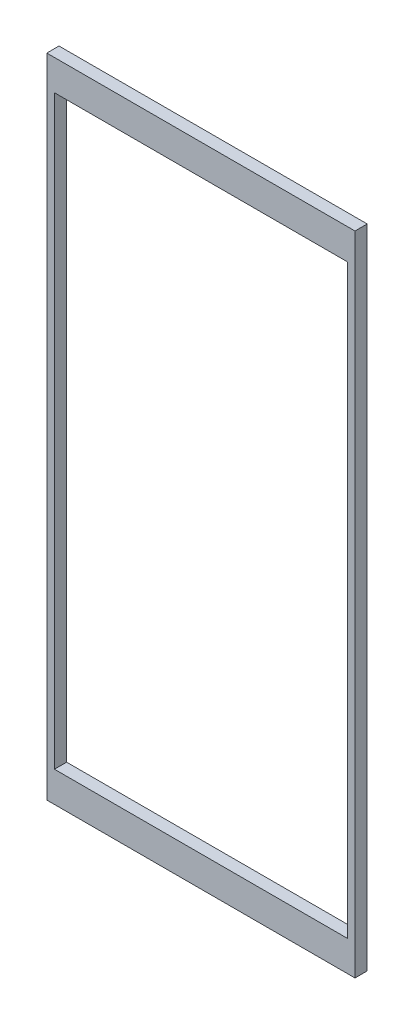
ISO-10303-21;
HEADER;
FILE_DESCRIPTION(('STEP AP214'),'2;1');
FILE_NAME('part.step','',(''),(''),'','','');
FILE_SCHEMA(('AUTOMOTIVE_DESIGN { 1 0 10303 214 1 1 1 1 }'));
ENDSEC;
DATA;
#1=APPLICATION_CONTEXT('core data for automotive mechanical design processes');
#2=APPLICATION_PROTOCOL_DEFINITION('international standard','automotive_design',2000,#1);
#3=PRODUCT_CONTEXT('',#1,'mechanical');
#4=PRODUCT('Part','Part','',(#3));
#5=PRODUCT_RELATED_PRODUCT_CATEGORY('part','',(#4));
#6=PRODUCT_DEFINITION_FORMATION('','',#4);
#7=PRODUCT_DEFINITION_CONTEXT('part definition',#1,'design');
#8=PRODUCT_DEFINITION('design','',#6,#7);
#9=PRODUCT_DEFINITION_SHAPE('','',#8);
#10=(LENGTH_UNIT() NAMED_UNIT(*) SI_UNIT(.MILLI.,.METRE.));
#11=(NAMED_UNIT(*) PLANE_ANGLE_UNIT() SI_UNIT($,.RADIAN.));
#12=(NAMED_UNIT(*) SI_UNIT($,.STERADIAN.) SOLID_ANGLE_UNIT());
#13=UNCERTAINTY_MEASURE_WITH_UNIT(LENGTH_MEASURE(1.E-05),#10,'distance_accuracy_value','');
#14=(GEOMETRIC_REPRESENTATION_CONTEXT(3) GLOBAL_UNCERTAINTY_ASSIGNED_CONTEXT((#13)) GLOBAL_UNIT_ASSIGNED_CONTEXT((#10,
#11,#12)) REPRESENTATION_CONTEXT('',''));
#15=CARTESIAN_POINT('',(0.,0.,0.));
#16=DIRECTION('',(0.,0.,1.));
#17=DIRECTION('',(1.,0.,0.));
#18=AXIS2_PLACEMENT_3D('',#15,#16,#17);
#19=CARTESIAN_POINT('',(0.,0.,8.));
#20=DIRECTION('',(1.,0.,0.));
#21=DIRECTION('',(0.,1.,0.));
#22=AXIS2_PLACEMENT_3D('',#19,#20,#21);
#23=PLANE('',#22);
#24=DIRECTION('',(0.,-1.,0.));
#25=VECTOR('',#24,1.);
#26=CARTESIAN_POINT('',(0.,0.,0.));
#27=LINE('',#26,#25);
#28=CARTESIAN_POINT('',(0.,424.,0.));
#29=VERTEX_POINT('',#28);
#30=CARTESIAN_POINT('',(0.,0.,0.));
#31=VERTEX_POINT('',#30);
#32=EDGE_CURVE('E155',#29,#31,#27,.T.);
#33=ORIENTED_EDGE('',*,*,#32,.T.);
#34=DIRECTION('',(0.,0.,-1.));
#35=VECTOR('',#34,1.);
#36=CARTESIAN_POINT('',(0.,0.,8.));
#37=LINE('',#36,#35);
#38=CARTESIAN_POINT('',(0.,0.,8.));
#39=VERTEX_POINT('',#38);
#40=EDGE_CURVE('E11',#39,#31,#37,.T.);
#41=ORIENTED_EDGE('',*,*,#40,.F.);
#42=DIRECTION('',(0.,-1.,0.));
#43=VECTOR('',#42,1.);
#44=CARTESIAN_POINT('',(0.,0.,8.));
#45=LINE('',#44,#43);
#46=CARTESIAN_POINT('',(0.,424.,8.));
#47=VERTEX_POINT('',#46);
#48=EDGE_CURVE('E161',#47,#39,#45,.T.);
#49=ORIENTED_EDGE('',*,*,#48,.F.);
#50=DIRECTION('',(0.,0.,-1.));
#51=VECTOR('',#50,1.);
#52=CARTESIAN_POINT('',(0.,424.,8.));
#53=LINE('',#52,#51);
#54=EDGE_CURVE('E175',#47,#29,#53,.T.);
#55=ORIENTED_EDGE('',*,*,#54,.T.);
#56=EDGE_LOOP('',(#33,#41,#49,#55));
#57=FACE_BOUND('',#56,.T.);
#58=ADVANCED_FACE('F43',(#57),#23,.F.);
#59=CARTESIAN_POINT('',(0.,0.,8.));
#60=DIRECTION('',(0.,1.,0.));
#61=DIRECTION('',(0.,0.,1.));
#62=AXIS2_PLACEMENT_3D('',#59,#60,#61);
#63=PLANE('',#62);
#64=DIRECTION('',(1.,0.,0.));
#65=VECTOR('',#64,1.);
#66=CARTESIAN_POINT('',(0.,0.,0.));
#67=LINE('',#66,#65);
#68=CARTESIAN_POINT('',(202.,0.,0.));
#69=VERTEX_POINT('',#68);
#70=EDGE_CURVE('E179',#31,#69,#67,.T.);
#71=ORIENTED_EDGE('',*,*,#70,.T.);
#72=DIRECTION('',(0.,0.,-1.));
#73=VECTOR('',#72,1.);
#74=CARTESIAN_POINT('',(202.,0.,8.));
#75=LINE('',#74,#73);
#76=CARTESIAN_POINT('',(202.,0.,8.));
#77=VERTEX_POINT('',#76);
#78=EDGE_CURVE('E51',#77,#69,#75,.T.);
#79=ORIENTED_EDGE('',*,*,#78,.F.);
#80=DIRECTION('',(1.,0.,0.));
#81=VECTOR('',#80,1.);
#82=CARTESIAN_POINT('',(0.,0.,8.));
#83=LINE('',#82,#81);
#84=EDGE_CURVE('E165',#39,#77,#83,.T.);
#85=ORIENTED_EDGE('',*,*,#84,.F.);
#86=ORIENTED_EDGE('',*,*,#40,.T.);
#87=EDGE_LOOP('',(#71,#79,#85,#86));
#88=FACE_BOUND('',#87,.T.);
#89=ADVANCED_FACE('F213',(#88),#63,.F.);
#90=CARTESIAN_POINT('',(202.,0.,8.));
#91=DIRECTION('',(-1.,0.,0.));
#92=DIRECTION('',(0.,-1.,0.));
#93=AXIS2_PLACEMENT_3D('',#90,#91,#92);
#94=PLANE('',#93);
#95=DIRECTION('',(0.,1.,0.));
#96=VECTOR('',#95,1.);
#97=CARTESIAN_POINT('',(202.,0.,0.));
#98=LINE('',#97,#96);
#99=CARTESIAN_POINT('',(202.,424.,0.));
#100=VERTEX_POINT('',#99);
#101=EDGE_CURVE('E182',#69,#100,#98,.T.);
#102=ORIENTED_EDGE('',*,*,#101,.T.);
#103=DIRECTION('',(0.,0.,-1.));
#104=VECTOR('',#103,1.);
#105=CARTESIAN_POINT('',(202.,424.,8.));
#106=LINE('',#105,#104);
#107=CARTESIAN_POINT('',(202.,424.,8.));
#108=VERTEX_POINT('',#107);
#109=EDGE_CURVE('E190',#108,#100,#106,.T.);
#110=ORIENTED_EDGE('',*,*,#109,.F.);
#111=DIRECTION('',(0.,1.,0.));
#112=VECTOR('',#111,1.);
#113=CARTESIAN_POINT('',(202.,0.,8.));
#114=LINE('',#113,#112);
#115=EDGE_CURVE('E169',#77,#108,#114,.T.);
#116=ORIENTED_EDGE('',*,*,#115,.F.);
#117=ORIENTED_EDGE('',*,*,#78,.T.);
#118=EDGE_LOOP('',(#102,#110,#116,#117));
#119=FACE_BOUND('',#118,.T.);
#120=ADVANCED_FACE('F199',(#119),#94,.F.);
#121=CARTESIAN_POINT('',(0.,424.,8.));
#122=DIRECTION('',(0.,-1.,0.));
#123=DIRECTION('',(0.,0.,-1.));
#124=AXIS2_PLACEMENT_3D('',#121,#122,#123);
#125=PLANE('',#124);
#126=DIRECTION('',(-1.,0.,0.));
#127=VECTOR('',#126,1.);
#128=CARTESIAN_POINT('',(0.,424.,0.));
#129=LINE('',#128,#127);
#130=EDGE_CURVE('E166',#100,#29,#129,.T.);
#131=ORIENTED_EDGE('',*,*,#130,.T.);
#132=ORIENTED_EDGE('',*,*,#54,.F.);
#133=DIRECTION('',(-1.,0.,0.));
#134=VECTOR('',#133,1.);
#135=CARTESIAN_POINT('',(0.,424.,8.));
#136=LINE('',#135,#134);
#137=EDGE_CURVE('E172',#108,#47,#136,.T.);
#138=ORIENTED_EDGE('',*,*,#137,.F.);
#139=ORIENTED_EDGE('',*,*,#109,.T.);
#140=EDGE_LOOP('',(#131,#132,#138,#139));
#141=FACE_BOUND('',#140,.T.);
#142=ADVANCED_FACE('F208',(#141),#125,.F.);
#143=CARTESIAN_POINT('',(0.,0.,8.));
#144=DIRECTION('',(0.,0.,-1.));
#145=DIRECTION('',(-1.,0.,0.));
#146=AXIS2_PLACEMENT_3D('',#143,#144,#145);
#147=PLANE('',#146);
#148=DIRECTION('',(1.,0.,0.));
#149=VECTOR('',#148,1.);
#150=CARTESIAN_POINT('',(197.,404.,8.));
#151=LINE('',#150,#149);
#152=CARTESIAN_POINT('',(4.99999999999992,404.,8.));
#153=VERTEX_POINT('',#152);
#154=CARTESIAN_POINT('',(197.,404.,8.));
#155=VERTEX_POINT('',#154);
#156=EDGE_CURVE('E117',#153,#155,#151,.T.);
#157=ORIENTED_EDGE('',*,*,#156,.T.);
#158=DIRECTION('',(0.,-1.,0.));
#159=VECTOR('',#158,1.);
#160=CARTESIAN_POINT('',(197.,404.,8.));
#161=LINE('',#160,#159);
#162=CARTESIAN_POINT('',(197.,20.,8.));
#163=VERTEX_POINT('',#162);
#164=EDGE_CURVE('E110',#155,#163,#161,.T.);
#165=ORIENTED_EDGE('',*,*,#164,.T.);
#166=DIRECTION('',(-1.,0.,0.));
#167=VECTOR('',#166,1.);
#168=CARTESIAN_POINT('',(197.,20.,8.));
#169=LINE('',#168,#167);
#170=CARTESIAN_POINT('',(4.99999999999987,20.,8.));
#171=VERTEX_POINT('',#170);
#172=EDGE_CURVE('E120',#163,#171,#169,.T.);
#173=ORIENTED_EDGE('',*,*,#172,.T.);
#174=DIRECTION('',(0.,1.,0.));
#175=VECTOR('',#174,1.);
#176=CARTESIAN_POINT('',(4.99999999999992,404.,8.));
#177=LINE('',#176,#175);
#178=EDGE_CURVE('E58',#171,#153,#177,.T.);
#179=ORIENTED_EDGE('',*,*,#178,.T.);
#180=EDGE_LOOP('',(#157,#165,#173,#179));
#181=FACE_BOUND('',#180,.T.);
#182=ORIENTED_EDGE('',*,*,#48,.T.);
#183=ORIENTED_EDGE('',*,*,#84,.T.);
#184=ORIENTED_EDGE('',*,*,#115,.T.);
#185=ORIENTED_EDGE('',*,*,#137,.T.);
#186=EDGE_LOOP('',(#182,#183,#184,#185));
#187=FACE_BOUND('',#186,.T.);
#188=ADVANCED_FACE('F125',(#181,#187),#147,.F.);
#189=CARTESIAN_POINT('',(0.,0.,0.));
#190=DIRECTION('',(0.,0.,-1.));
#191=DIRECTION('',(-1.,0.,0.));
#192=AXIS2_PLACEMENT_3D('',#189,#190,#191);
#193=PLANE('',#192);
#194=CARTESIAN_POINT('',(184.,10.,0.));
#195=DIRECTION('',(0.,0.,1.));
#196=DIRECTION('',(-1.,0.,0.));
#197=AXIS2_PLACEMENT_3D('',#194,#195,#196);
#198=CIRCLE('',#197,2.);
#199=CARTESIAN_POINT('',(182.,10.,0.));
#200=VERTEX_POINT('',#199);
#201=EDGE_CURVE('E292',#200,#200,#198,.T.);
#202=ORIENTED_EDGE('',*,*,#201,.T.);
#203=EDGE_LOOP('',(#202));
#204=FACE_BOUND('',#203,.T.);
#205=CARTESIAN_POINT('',(17.9999999999999,10.,0.));
#206=DIRECTION('',(0.,0.,1.));
#207=DIRECTION('',(-1.,0.,0.));
#208=AXIS2_PLACEMENT_3D('',#205,#206,#207);
#209=CIRCLE('',#208,2.);
#210=CARTESIAN_POINT('',(15.9999999999999,10.,0.));
#211=VERTEX_POINT('',#210);
#212=EDGE_CURVE('E305',#211,#211,#209,.T.);
#213=ORIENTED_EDGE('',*,*,#212,.T.);
#214=EDGE_LOOP('',(#213));
#215=FACE_BOUND('',#214,.T.);
#216=CARTESIAN_POINT('',(101.,10.,0.));
#217=DIRECTION('',(0.,0.,1.));
#218=DIRECTION('',(-1.,0.,0.));
#219=AXIS2_PLACEMENT_3D('',#216,#217,#218);
#220=CIRCLE('',#219,2.);
#221=CARTESIAN_POINT('',(99.,10.,0.));
#222=VERTEX_POINT('',#221);
#223=EDGE_CURVE('E313',#222,#222,#220,.T.);
#224=ORIENTED_EDGE('',*,*,#223,.T.);
#225=EDGE_LOOP('',(#224));
#226=FACE_BOUND('',#225,.T.);
#227=CARTESIAN_POINT('',(184.,414.,0.));
#228=DIRECTION('',(0.,0.,-1.));
#229=DIRECTION('',(-1.,0.,0.));
#230=AXIS2_PLACEMENT_3D('',#227,#228,#229);
#231=CIRCLE('',#230,2.);
#232=CARTESIAN_POINT('',(182.,414.,0.));
#233=VERTEX_POINT('',#232);
#234=EDGE_CURVE('E320',#233,#233,#231,.T.);
#235=ORIENTED_EDGE('',*,*,#234,.F.);
#236=EDGE_LOOP('',(#235));
#237=FACE_BOUND('',#236,.T.);
#238=CARTESIAN_POINT('',(17.9999999999999,414.,0.));
#239=DIRECTION('',(0.,0.,-1.));
#240=DIRECTION('',(-1.,0.,0.));
#241=AXIS2_PLACEMENT_3D('',#238,#239,#240);
#242=CIRCLE('',#241,2.);
#243=CARTESIAN_POINT('',(15.9999999999999,414.,0.));
#244=VERTEX_POINT('',#243);
#245=EDGE_CURVE('E324',#244,#244,#242,.T.);
#246=ORIENTED_EDGE('',*,*,#245,.F.);
#247=EDGE_LOOP('',(#246));
#248=FACE_BOUND('',#247,.T.);
#249=CARTESIAN_POINT('',(101.,414.,0.));
#250=DIRECTION('',(0.,0.,-1.));
#251=DIRECTION('',(-1.,0.,0.));
#252=AXIS2_PLACEMENT_3D('',#249,#250,#251);
#253=CIRCLE('',#252,2.);
#254=CARTESIAN_POINT('',(99.,414.,0.));
#255=VERTEX_POINT('',#254);
#256=EDGE_CURVE('E297',#255,#255,#253,.T.);
#257=ORIENTED_EDGE('',*,*,#256,.F.);
#258=EDGE_LOOP('',(#257));
#259=FACE_BOUND('',#258,.T.);
#260=DIRECTION('',(0.,-1.,0.));
#261=VECTOR('',#260,1.);
#262=CARTESIAN_POINT('',(197.,404.,0.));
#263=LINE('',#262,#261);
#264=CARTESIAN_POINT('',(197.,404.,0.));
#265=VERTEX_POINT('',#264);
#266=CARTESIAN_POINT('',(197.,20.,0.));
#267=VERTEX_POINT('',#266);
#268=EDGE_CURVE('E66',#265,#267,#263,.T.);
#269=ORIENTED_EDGE('',*,*,#268,.F.);
#270=DIRECTION('',(1.,0.,0.));
#271=VECTOR('',#270,1.);
#272=CARTESIAN_POINT('',(197.,404.,0.));
#273=LINE('',#272,#271);
#274=CARTESIAN_POINT('',(4.99999999999992,404.,0.));
#275=VERTEX_POINT('',#274);
#276=EDGE_CURVE('E129',#275,#265,#273,.T.);
#277=ORIENTED_EDGE('',*,*,#276,.F.);
#278=DIRECTION('',(0.,1.,0.));
#279=VECTOR('',#278,1.);
#280=CARTESIAN_POINT('',(4.99999999999992,404.,0.));
#281=LINE('',#280,#279);
#282=CARTESIAN_POINT('',(4.99999999999987,20.,0.));
#283=VERTEX_POINT('',#282);
#284=EDGE_CURVE('E133',#283,#275,#281,.T.);
#285=ORIENTED_EDGE('',*,*,#284,.F.);
#286=DIRECTION('',(-1.,0.,0.));
#287=VECTOR('',#286,1.);
#288=CARTESIAN_POINT('',(197.,20.,0.));
#289=LINE('',#288,#287);
#290=EDGE_CURVE('E145',#267,#283,#289,.T.);
#291=ORIENTED_EDGE('',*,*,#290,.F.);
#292=EDGE_LOOP('',(#269,#277,#285,#291));
#293=FACE_BOUND('',#292,.T.);
#294=ORIENTED_EDGE('',*,*,#32,.F.);
#295=ORIENTED_EDGE('',*,*,#130,.F.);
#296=ORIENTED_EDGE('',*,*,#101,.F.);
#297=ORIENTED_EDGE('',*,*,#70,.F.);
#298=EDGE_LOOP('',(#294,#295,#296,#297));
#299=FACE_BOUND('',#298,.T.);
#300=ADVANCED_FACE('F205',(#204,#215,#226,#237,#248,#259,#293,#299),#193,.T.);
#301=CARTESIAN_POINT('',(197.,404.,8.));
#302=DIRECTION('',(1.,0.,0.));
#303=DIRECTION('',(0.,1.,0.));
#304=AXIS2_PLACEMENT_3D('',#301,#302,#303);
#305=PLANE('',#304);
#306=ORIENTED_EDGE('',*,*,#268,.T.);
#307=DIRECTION('',(0.,0.,-1.));
#308=VECTOR('',#307,1.);
#309=CARTESIAN_POINT('',(197.,20.,8.));
#310=LINE('',#309,#308);
#311=EDGE_CURVE('E106',#163,#267,#310,.T.);
#312=ORIENTED_EDGE('',*,*,#311,.F.);
#313=ORIENTED_EDGE('',*,*,#164,.F.);
#314=DIRECTION('',(0.,0.,-1.));
#315=VECTOR('',#314,1.);
#316=CARTESIAN_POINT('',(197.,404.,8.));
#317=LINE('',#316,#315);
#318=EDGE_CURVE('E152',#155,#265,#317,.T.);
#319=ORIENTED_EDGE('',*,*,#318,.T.);
#320=EDGE_LOOP('',(#306,#312,#313,#319));
#321=FACE_BOUND('',#320,.T.);
#322=ADVANCED_FACE('F108',(#321),#305,.F.);
#323=CARTESIAN_POINT('',(197.,404.,8.));
#324=DIRECTION('',(0.,1.,0.));
#325=DIRECTION('',(0.,0.,1.));
#326=AXIS2_PLACEMENT_3D('',#323,#324,#325);
#327=PLANE('',#326);
#328=ORIENTED_EDGE('',*,*,#276,.T.);
#329=ORIENTED_EDGE('',*,*,#318,.F.);
#330=ORIENTED_EDGE('',*,*,#156,.F.);
#331=DIRECTION('',(0.,0.,-1.));
#332=VECTOR('',#331,1.);
#333=CARTESIAN_POINT('',(4.99999999999992,404.,8.));
#334=LINE('',#333,#332);
#335=EDGE_CURVE('E156',#153,#275,#334,.T.);
#336=ORIENTED_EDGE('',*,*,#335,.T.);
#337=EDGE_LOOP('',(#328,#329,#330,#336));
#338=FACE_BOUND('',#337,.T.);
#339=ADVANCED_FACE('F230',(#338),#327,.F.);
#340=CARTESIAN_POINT('',(4.99999999999992,404.,8.));
#341=DIRECTION('',(-1.,0.,0.));
#342=DIRECTION('',(0.,-1.,0.));
#343=AXIS2_PLACEMENT_3D('',#340,#341,#342);
#344=PLANE('',#343);
#345=ORIENTED_EDGE('',*,*,#284,.T.);
#346=ORIENTED_EDGE('',*,*,#335,.F.);
#347=ORIENTED_EDGE('',*,*,#178,.F.);
#348=DIRECTION('',(0.,0.,-1.));
#349=VECTOR('',#348,1.);
#350=CARTESIAN_POINT('',(4.99999999999987,20.,8.));
#351=LINE('',#350,#349);
#352=EDGE_CURVE('E116',#171,#283,#351,.T.);
#353=ORIENTED_EDGE('',*,*,#352,.T.);
#354=EDGE_LOOP('',(#345,#346,#347,#353));
#355=FACE_BOUND('',#354,.T.);
#356=ADVANCED_FACE('F234',(#355),#344,.F.);
#357=CARTESIAN_POINT('',(197.,20.,8.));
#358=DIRECTION('',(0.,-1.,0.));
#359=DIRECTION('',(0.,0.,-1.));
#360=AXIS2_PLACEMENT_3D('',#357,#358,#359);
#361=PLANE('',#360);
#362=ORIENTED_EDGE('',*,*,#290,.T.);
#363=ORIENTED_EDGE('',*,*,#352,.F.);
#364=ORIENTED_EDGE('',*,*,#172,.F.);
#365=ORIENTED_EDGE('',*,*,#311,.T.);
#366=EDGE_LOOP('',(#362,#363,#364,#365));
#367=FACE_BOUND('',#366,.T.);
#368=ADVANCED_FACE('F121',(#367),#361,.F.);
#369=CARTESIAN_POINT('',(101.,414.,4.78));
#370=DIRECTION('',(0.,0.,-1.));
#371=DIRECTION('',(-1.,0.,0.));
#372=AXIS2_PLACEMENT_3D('',#369,#370,#371);
#373=CYLINDRICAL_SURFACE('',#372,2.);
#374=CARTESIAN_POINT('',(101.,414.,4.78));
#375=DIRECTION('',(0.,0.,-1.));
#376=DIRECTION('',(-1.,0.,0.));
#377=AXIS2_PLACEMENT_3D('',#374,#375,#376);
#378=CIRCLE('',#377,2.);
#379=CARTESIAN_POINT('',(99.,414.,4.78));
#380=VERTEX_POINT('',#379);
#381=EDGE_CURVE('E136',#380,#380,#378,.T.);
#382=ORIENTED_EDGE('',*,*,#381,.F.);
#383=EDGE_LOOP('',(#382));
#384=FACE_BOUND('',#383,.T.);
#385=ORIENTED_EDGE('',*,*,#256,.T.);
#386=EDGE_LOOP('',(#385));
#387=FACE_BOUND('',#386,.T.);
#388=ADVANCED_FACE('F233',(#384,#387),#373,.F.);
#389=CARTESIAN_POINT('',(101.,414.,4.78));
#390=DIRECTION('',(0.,0.,-1.));
#391=DIRECTION('',(-1.,0.,0.));
#392=AXIS2_PLACEMENT_3D('',#389,#390,#391);
#393=PLANE('',#392);
#394=ORIENTED_EDGE('',*,*,#381,.T.);
#395=EDGE_LOOP('',(#394));
#396=FACE_BOUND('',#395,.T.);
#397=ADVANCED_FACE('F240',(#396),#393,.T.);
#398=CARTESIAN_POINT('',(17.9999999999999,414.,4.78));
#399=DIRECTION('',(0.,0.,-1.));
#400=DIRECTION('',(-1.,0.,0.));
#401=AXIS2_PLACEMENT_3D('',#398,#399,#400);
#402=CYLINDRICAL_SURFACE('',#401,2.);
#403=CARTESIAN_POINT('',(17.9999999999999,414.,4.78));
#404=DIRECTION('',(0.,0.,-1.));
#405=DIRECTION('',(-1.,0.,0.));
#406=AXIS2_PLACEMENT_3D('',#403,#404,#405);
#407=CIRCLE('',#406,2.);
#408=CARTESIAN_POINT('',(15.9999999999999,414.,4.78));
#409=VERTEX_POINT('',#408);
#410=EDGE_CURVE('E328',#409,#409,#407,.T.);
#411=ORIENTED_EDGE('',*,*,#410,.F.);
#412=EDGE_LOOP('',(#411));
#413=FACE_BOUND('',#412,.T.);
#414=ORIENTED_EDGE('',*,*,#245,.T.);
#415=EDGE_LOOP('',(#414));
#416=FACE_BOUND('',#415,.T.);
#417=ADVANCED_FACE('F243',(#413,#416),#402,.F.);
#418=CARTESIAN_POINT('',(17.9999999999999,414.,4.78));
#419=DIRECTION('',(0.,0.,-1.));
#420=DIRECTION('',(-1.,0.,0.));
#421=AXIS2_PLACEMENT_3D('',#418,#419,#420);
#422=PLANE('',#421);
#423=ORIENTED_EDGE('',*,*,#410,.T.);
#424=EDGE_LOOP('',(#423));
#425=FACE_BOUND('',#424,.T.);
#426=ADVANCED_FACE('F248',(#425),#422,.T.);
#427=CARTESIAN_POINT('',(184.,414.,4.78));
#428=DIRECTION('',(0.,0.,-1.));
#429=DIRECTION('',(-1.,0.,0.));
#430=AXIS2_PLACEMENT_3D('',#427,#428,#429);
#431=CYLINDRICAL_SURFACE('',#430,2.);
#432=CARTESIAN_POINT('',(184.,414.,4.78));
#433=DIRECTION('',(0.,0.,-1.));
#434=DIRECTION('',(-1.,0.,0.));
#435=AXIS2_PLACEMENT_3D('',#432,#433,#434);
#436=CIRCLE('',#435,2.);
#437=CARTESIAN_POINT('',(182.,414.,4.78));
#438=VERTEX_POINT('',#437);
#439=EDGE_CURVE('E146',#438,#438,#436,.T.);
#440=ORIENTED_EDGE('',*,*,#439,.F.);
#441=EDGE_LOOP('',(#440));
#442=FACE_BOUND('',#441,.T.);
#443=ORIENTED_EDGE('',*,*,#234,.T.);
#444=EDGE_LOOP('',(#443));
#445=FACE_BOUND('',#444,.T.);
#446=ADVANCED_FACE('F251',(#442,#445),#431,.F.);
#447=CARTESIAN_POINT('',(184.,414.,4.78));
#448=DIRECTION('',(0.,0.,-1.));
#449=DIRECTION('',(-1.,0.,0.));
#450=AXIS2_PLACEMENT_3D('',#447,#448,#449);
#451=PLANE('',#450);
#452=ORIENTED_EDGE('',*,*,#439,.T.);
#453=EDGE_LOOP('',(#452));
#454=FACE_BOUND('',#453,.T.);
#455=ADVANCED_FACE('F258',(#454),#451,.T.);
#456=CARTESIAN_POINT('',(101.,10.,4.78));
#457=DIRECTION('',(0.,0.,-1.));
#458=DIRECTION('',(-1.,0.,0.));
#459=AXIS2_PLACEMENT_3D('',#456,#457,#458);
#460=CYLINDRICAL_SURFACE('',#459,2.);
#461=CARTESIAN_POINT('',(101.,10.,4.78));
#462=DIRECTION('',(0.,0.,1.));
#463=DIRECTION('',(-1.,0.,0.));
#464=AXIS2_PLACEMENT_3D('',#461,#462,#463);
#465=CIRCLE('',#464,2.);
#466=CARTESIAN_POINT('',(99.,10.,4.78));
#467=VERTEX_POINT('',#466);
#468=EDGE_CURVE('E309',#467,#467,#465,.T.);
#469=ORIENTED_EDGE('',*,*,#468,.T.);
#470=EDGE_LOOP('',(#469));
#471=FACE_BOUND('',#470,.T.);
#472=ORIENTED_EDGE('',*,*,#223,.F.);
#473=EDGE_LOOP('',(#472));
#474=FACE_BOUND('',#473,.T.);
#475=ADVANCED_FACE('F262',(#471,#474),#460,.F.);
#476=CARTESIAN_POINT('',(101.,10.,4.78));
#477=DIRECTION('',(0.,0.,-1.));
#478=DIRECTION('',(-1.,0.,0.));
#479=AXIS2_PLACEMENT_3D('',#476,#477,#478);
#480=PLANE('',#479);
#481=ORIENTED_EDGE('',*,*,#468,.F.);
#482=EDGE_LOOP('',(#481));
#483=FACE_BOUND('',#482,.T.);
#484=ADVANCED_FACE('F266',(#483),#480,.T.);
#485=CARTESIAN_POINT('',(17.9999999999999,10.,4.78));
#486=DIRECTION('',(0.,0.,-1.));
#487=DIRECTION('',(-1.,0.,0.));
#488=AXIS2_PLACEMENT_3D('',#485,#486,#487);
#489=CYLINDRICAL_SURFACE('',#488,2.);
#490=CARTESIAN_POINT('',(17.9999999999999,10.,4.78));
#491=DIRECTION('',(0.,0.,1.));
#492=DIRECTION('',(-1.,0.,0.));
#493=AXIS2_PLACEMENT_3D('',#490,#491,#492);
#494=CIRCLE('',#493,2.);
#495=CARTESIAN_POINT('',(15.9999999999999,10.,4.78));
#496=VERTEX_POINT('',#495);
#497=EDGE_CURVE('E299',#496,#496,#494,.T.);
#498=ORIENTED_EDGE('',*,*,#497,.T.);
#499=EDGE_LOOP('',(#498));
#500=FACE_BOUND('',#499,.T.);
#501=ORIENTED_EDGE('',*,*,#212,.F.);
#502=EDGE_LOOP('',(#501));
#503=FACE_BOUND('',#502,.T.);
#504=ADVANCED_FACE('F270',(#500,#503),#489,.F.);
#505=CARTESIAN_POINT('',(17.9999999999999,10.,4.78));
#506=DIRECTION('',(0.,0.,-1.));
#507=DIRECTION('',(-1.,0.,0.));
#508=AXIS2_PLACEMENT_3D('',#505,#506,#507);
#509=PLANE('',#508);
#510=ORIENTED_EDGE('',*,*,#497,.F.);
#511=EDGE_LOOP('',(#510));
#512=FACE_BOUND('',#511,.T.);
#513=ADVANCED_FACE('F274',(#512),#509,.T.);
#514=CARTESIAN_POINT('',(184.,10.,4.78));
#515=DIRECTION('',(0.,0.,-1.));
#516=DIRECTION('',(-1.,0.,0.));
#517=AXIS2_PLACEMENT_3D('',#514,#515,#516);
#518=CYLINDRICAL_SURFACE('',#517,2.);
#519=CARTESIAN_POINT('',(184.,10.,4.78));
#520=DIRECTION('',(0.,0.,1.));
#521=DIRECTION('',(-1.,0.,0.));
#522=AXIS2_PLACEMENT_3D('',#519,#520,#521);
#523=CIRCLE('',#522,2.);
#524=CARTESIAN_POINT('',(182.,10.,4.78));
#525=VERTEX_POINT('',#524);
#526=EDGE_CURVE('E290',#525,#525,#523,.T.);
#527=ORIENTED_EDGE('',*,*,#526,.T.);
#528=EDGE_LOOP('',(#527));
#529=FACE_BOUND('',#528,.T.);
#530=ORIENTED_EDGE('',*,*,#201,.F.);
#531=EDGE_LOOP('',(#530));
#532=FACE_BOUND('',#531,.T.);
#533=ADVANCED_FACE('F278',(#529,#532),#518,.F.);
#534=CARTESIAN_POINT('',(184.,10.,4.78));
#535=DIRECTION('',(0.,0.,-1.));
#536=DIRECTION('',(-1.,0.,0.));
#537=AXIS2_PLACEMENT_3D('',#534,#535,#536);
#538=PLANE('',#537);
#539=ORIENTED_EDGE('',*,*,#526,.F.);
#540=EDGE_LOOP('',(#539));
#541=FACE_BOUND('',#540,.T.);
#542=ADVANCED_FACE('F282',(#541),#538,.T.);
#543=CLOSED_SHELL('',(#58,#89,#120,#142,#188,#300,#322,#339,#356,#368,#388,#397,#417,#426,#446,
#455,#475,#484,#504,#513,#533,#542));
#544=MANIFOLD_SOLID_BREP('B2',#543);
#545=ADVANCED_BREP_SHAPE_REPRESENTATION('',(#18,#544),#14);
#546=SHAPE_DEFINITION_REPRESENTATION(#9,#545);
ENDSEC;
END-ISO-10303-21;
